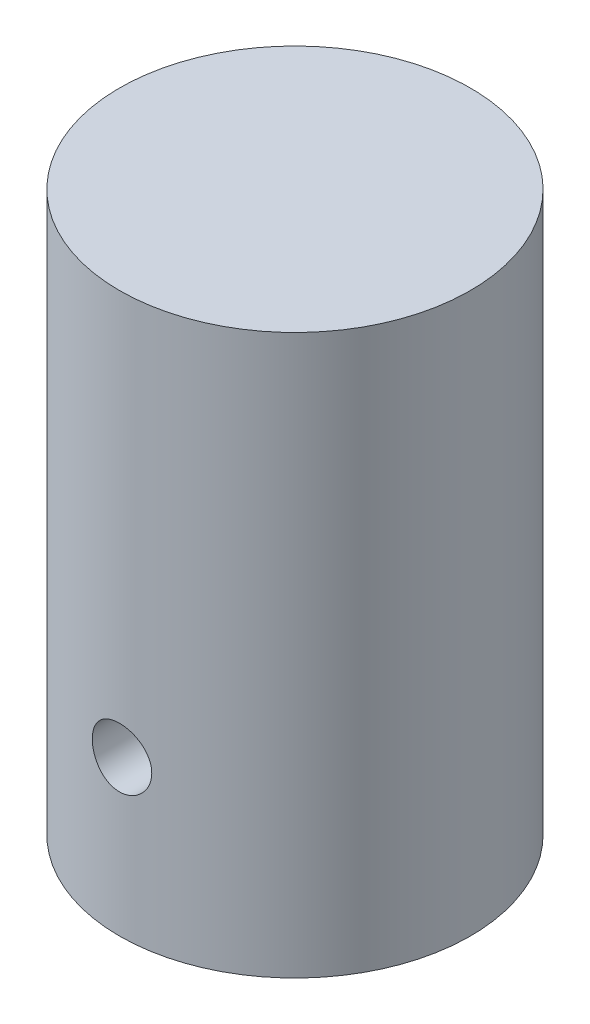
ISO-10303-21;
HEADER;
FILE_DESCRIPTION(('STEP AP214'),'2;1');
FILE_NAME('part.step','',(''),(''),'','','');
FILE_SCHEMA(('AUTOMOTIVE_DESIGN { 1 0 10303 214 1 1 1 1 }'));
ENDSEC;
DATA;
#1=APPLICATION_CONTEXT('core data for automotive mechanical design processes');
#2=APPLICATION_PROTOCOL_DEFINITION('international standard','automotive_design',2000,#1);
#3=PRODUCT_CONTEXT('',#1,'mechanical');
#4=PRODUCT('Part','Part','',(#3));
#5=PRODUCT_RELATED_PRODUCT_CATEGORY('part','',(#4));
#6=PRODUCT_DEFINITION_FORMATION('','',#4);
#7=PRODUCT_DEFINITION_CONTEXT('part definition',#1,'design');
#8=PRODUCT_DEFINITION('design','',#6,#7);
#9=PRODUCT_DEFINITION_SHAPE('','',#8);
#10=(LENGTH_UNIT() NAMED_UNIT(*) SI_UNIT(.MILLI.,.METRE.));
#11=(NAMED_UNIT(*) PLANE_ANGLE_UNIT() SI_UNIT($,.RADIAN.));
#12=(NAMED_UNIT(*) SI_UNIT($,.STERADIAN.) SOLID_ANGLE_UNIT());
#13=UNCERTAINTY_MEASURE_WITH_UNIT(LENGTH_MEASURE(1.E-05),#10,'distance_accuracy_value','');
#14=(GEOMETRIC_REPRESENTATION_CONTEXT(3) GLOBAL_UNCERTAINTY_ASSIGNED_CONTEXT((#13)) GLOBAL_UNIT_ASSIGNED_CONTEXT((#10,
#11,#12)) REPRESENTATION_CONTEXT('',''));
#15=CARTESIAN_POINT('',(0.,0.,0.));
#16=DIRECTION('',(0.,0.,1.));
#17=DIRECTION('',(1.,0.,0.));
#18=AXIS2_PLACEMENT_3D('',#15,#16,#17);
#19=CARTESIAN_POINT('',(0.,119.38,0.));
#20=DIRECTION('',(0.,-1.,0.));
#21=DIRECTION('',(0.,0.,-1.));
#22=AXIS2_PLACEMENT_3D('',#19,#20,#21);
#23=CYLINDRICAL_SURFACE('',#22,37.465);
#24=CARTESIAN_POINT('',(6.35,33.02,36.9229430706708));
#25=CARTESIAN_POINT('',(6.35000279141171,32.8429779279102,36.9229417748591));
#26=CARTESIAN_POINT('',(6.34259532528094,32.6659933481382,36.924218600387));
#27=CARTESIAN_POINT('',(6.3130271330691,32.313242688087,36.9292858540445));
#28=CARTESIAN_POINT('',(6.29086351707607,32.1374768533069,36.9330767745454));
#29=CARTESIAN_POINT('',(6.23193058823662,31.7883737158959,36.9430663826917));
#30=CARTESIAN_POINT('',(6.19515215922365,31.6150379990775,36.9492665730948));
#31=CARTESIAN_POINT('',(6.10725675226593,31.2720688886345,36.9638962260846));
#32=CARTESIAN_POINT('',(6.05613450827856,31.1024368794501,36.9723265073391));
#33=CARTESIAN_POINT('',(5.94001398475862,30.7683400061689,36.9911598987731));
#34=CARTESIAN_POINT('',(5.87503283304677,30.6038690489028,37.0015605720459));
#35=CARTESIAN_POINT('',(5.73160931419481,30.2809531587946,37.024048226987));
#36=CARTESIAN_POINT('',(5.65316198508221,30.1225104736148,37.0361358299416));
#37=CARTESIAN_POINT('',(5.48342916226199,29.8128734349299,37.0616457673502));
#38=CARTESIAN_POINT('',(5.39214998328585,29.6616755649309,37.0750674443417));
#39=CARTESIAN_POINT('',(5.19733044249672,29.367411205207,37.1028794422679));
#40=CARTESIAN_POINT('',(5.09378551997719,29.2243477695128,37.1172701226382));
#41=CARTESIAN_POINT('',(4.87421779068985,28.9461597195228,37.146744116124));
#42=CARTESIAN_POINT('',(4.75809364747908,28.8111156041066,37.1618323914032));
#43=CARTESIAN_POINT('',(4.51488121897134,28.551215519359,37.1921643883722));
#44=CARTESIAN_POINT('',(4.3877888897322,28.4263633410675,37.2074081655528));
#45=CARTESIAN_POINT('',(4.12358831809976,28.1877967478572,37.2376142207968));
#46=CARTESIAN_POINT('',(3.98648315756614,28.0740789308957,37.2525765837088));
#47=CARTESIAN_POINT('',(3.70310692352254,27.858487943453,37.281812153211));
#48=CARTESIAN_POINT('',(3.55683248965142,27.7566191549295,37.2960851037118));
#49=CARTESIAN_POINT('',(3.25528646093831,27.564937093672,37.3236169600895));
#50=CARTESIAN_POINT('',(3.09996739305173,27.4751975512082,37.3368694703722));
#51=CARTESIAN_POINT('',(2.78214446136281,27.309103441585,37.3618966515687));
#52=CARTESIAN_POINT('',(2.61963794116679,27.2327538758421,37.3736707698099));
#53=CARTESIAN_POINT('',(2.28869512625808,27.0940797494783,37.3953948025334));
#54=CARTESIAN_POINT('',(2.12026136913199,27.0317492694472,37.4053454866114));
#55=CARTESIAN_POINT('',(1.77860742000098,26.9215298267097,37.4231499027759));
#56=CARTESIAN_POINT('',(1.60538550554222,26.8736461367658,37.4310028691218));
#57=CARTESIAN_POINT('',(1.08386846683103,26.7531119562433,37.4509148486679));
#58=CARTESIAN_POINT('',(0.73015872504387,26.7020912500178,37.4595677631988));
#59=CARTESIAN_POINT('',(0.0192946776186457,26.6600414383014,37.4666841086695));
#60=CARTESIAN_POINT('',(-0.337859384488472,26.669008122004,37.4651482548085));
#61=CARTESIAN_POINT('',(-1.04184938818574,26.7461584808905,37.4521482632217));
#62=CARTESIAN_POINT('',(-1.38875354291931,26.8137347170075,37.4407859717608));
#63=CARTESIAN_POINT('',(-2.06621277185893,27.0052502774216,37.4095186888445));
#64=CARTESIAN_POINT('',(-2.39676733453492,27.1291913639717,37.3896134302934));
#65=CARTESIAN_POINT('',(-3.03396211682997,27.4305133275901,37.3433249625064));
#66=CARTESIAN_POINT('',(-3.34048213700312,27.6081436009934,37.316911630219));
#67=CARTESIAN_POINT('',(-3.91959227462119,28.0116203392101,37.2605395168837));
#68=CARTESIAN_POINT('',(-4.19217955142351,28.2374708364357,37.2305804394166));
#69=CARTESIAN_POINT('',(-4.69927895714922,28.7343438510591,37.1700034224869));
#70=CARTESIAN_POINT('',(-4.93327053922575,29.0058975034978,37.1393819324612));
#71=CARTESIAN_POINT('',(-5.35245392593285,29.5846815641848,37.0812942455192));
#72=CARTESIAN_POINT('',(-5.53764525006624,29.8919123236743,37.0538280796725));
#73=CARTESIAN_POINT('',(-5.85407953710823,30.5339442406,37.0051585911984));
#74=CARTESIAN_POINT('',(-5.98525815710648,30.8687777135642,36.9839627465329));
#75=CARTESIAN_POINT('',(-6.18936206426045,31.556167311694,36.9503562312994));
#76=CARTESIAN_POINT('',(-6.26229266738911,31.9087218164371,36.9379447590422));
#77=CARTESIAN_POINT('',(-6.34709384460755,32.6168835055322,36.9234678421246));
#78=CARTESIAN_POINT('',(-6.35970721768158,32.9723992502977,36.9212765456527));
#79=CARTESIAN_POINT('',(-6.32549683373919,33.6804613982253,36.9271526737609));
#80=CARTESIAN_POINT('',(-6.27867545446003,34.0330079196058,36.9352196879487));
#81=CARTESIAN_POINT('',(-6.12755856328144,34.7227539742049,36.9605870866626));
#82=CARTESIAN_POINT('',(-6.02364259931067,35.0600391050828,36.9778264723004));
#83=CARTESIAN_POINT('',(-5.76168490296192,35.7124080067798,37.0195448040393));
#84=CARTESIAN_POINT('',(-5.60363983348741,36.0274904073409,37.0440241964792));
#85=CARTESIAN_POINT('',(-5.23616310891025,36.629811414514,37.0977560143979));
#86=CARTESIAN_POINT('',(-5.02625632334476,36.9167562145644,37.1270516831742));
#87=CARTESIAN_POINT('',(-4.56166401992295,37.4516159849238,37.1869892749972));
#88=CARTESIAN_POINT('',(-4.30697524051591,37.6995281099207,37.217631295979));
#89=CARTESIAN_POINT('',(-3.75675903815107,38.1520061184341,37.2772080912782));
#90=CARTESIAN_POINT('',(-3.46082109485542,38.3560760897849,37.3061209088732));
#91=CARTESIAN_POINT('',(-2.83841657324286,38.7115984068522,37.3586264947807));
#92=CARTESIAN_POINT('',(-2.51195100873064,38.8630524991246,37.3822194396744));
#93=CARTESIAN_POINT('',(-1.83928606066536,39.1082817900893,37.421334207005));
#94=CARTESIAN_POINT('',(-1.49318246426715,39.2023144056904,37.4368920013525));
#95=CARTESIAN_POINT('',(-0.789612381808293,39.33083762764,37.4583264559331));
#96=CARTESIAN_POINT('',(-0.432146866718397,39.365333308058,37.4642039411742));
#97=CARTESIAN_POINT('',(0.101984465339863,39.3716501433896,37.4652822069458));
#98=CARTESIAN_POINT('',(0.278660824538069,39.3663448034955,37.4643792461815));
#99=CARTESIAN_POINT('',(0.630910248375704,39.3410416873006,37.4600999348255));
#100=CARTESIAN_POINT('',(0.806483702727592,39.3210494338571,37.4567245139773));
#101=CARTESIAN_POINT('',(1.15534231245423,39.2665096396473,37.4475887044141));
#102=CARTESIAN_POINT('',(1.32862663390469,39.2319569375789,37.4418274700023));
#103=CARTESIAN_POINT('',(1.67157269701812,39.1485780582277,37.4280844037534));
#104=CARTESIAN_POINT('',(1.84123571960936,39.0997570208375,37.4201033716055));
#105=CARTESIAN_POINT('',(2.17567198668656,38.9882491419048,37.4021483486495));
#106=CARTESIAN_POINT('',(2.34044923358439,38.925574026656,37.3921760439695));
#107=CARTESIAN_POINT('',(2.66407136469494,38.7868196261229,37.3705130033313));
#108=CARTESIAN_POINT('',(2.82291834908299,38.7107451418,37.3588228831101));
#109=CARTESIAN_POINT('',(3.13372361602806,38.5456899649814,37.3340369935162));
#110=CARTESIAN_POINT('',(3.28567916728831,38.4567042130054,37.3209406736277));
#111=CARTESIAN_POINT('',(3.58156051285462,38.266507812355,37.2937088207987));
#112=CARTESIAN_POINT('',(3.72548910131004,38.1653014569379,37.2795736534978));
#113=CARTESIAN_POINT('',(4.0061175405423,37.9500279829882,37.2504683547157));
#114=CARTESIAN_POINT('',(4.14270774436707,37.8358189937871,37.2354901389976));
#115=CARTESIAN_POINT('',(4.40575720486539,37.5963983703591,37.2052826069384));
#116=CARTESIAN_POINT('',(4.53222005739372,37.4711906747823,37.1900533820582));
#117=CARTESIAN_POINT('',(4.77427711512343,37.2105169336016,37.1597550265217));
#118=CARTESIAN_POINT('',(4.8898647624007,37.0750447861258,37.1446859972621));
#119=CARTESIAN_POINT('',(5.10924511026962,36.7948850831837,37.1151463601762));
#120=CARTESIAN_POINT('',(5.2130421433657,36.6502009433935,37.1006755337894));
#121=CARTESIAN_POINT('',(5.40891750548062,36.3514062770834,37.0726274388618));
#122=CARTESIAN_POINT('',(5.50089893076861,36.1972314673241,37.0590579519227));
#123=CARTESIAN_POINT('',(5.67149208696552,35.8816160179082,37.0333342280351));
#124=CARTESIAN_POINT('',(5.75010873763827,35.720178079709,37.0211794708262));
#125=CARTESIAN_POINT('',(5.89338024297566,35.3912284690087,36.9986426334629));
#126=CARTESIAN_POINT('',(5.95804473056657,35.2237210809342,36.9882593312945));
#127=CARTESIAN_POINT('',(6.0729737087923,34.8837837201648,36.9695630766091));
#128=CARTESIAN_POINT('',(6.1232412714356,34.7113548062705,36.9612496824657));
#129=CARTESIAN_POINT('',(6.22707453855869,34.2892845729493,36.9439259134538));
#130=CARTESIAN_POINT('',(6.27311607180392,34.037703905521,36.9360961033579));
#131=CARTESIAN_POINT('',(6.3345764955392,33.530722778203,36.9256056660701));
#132=CARTESIAN_POINT('',(6.34999597389238,33.2753223917367,36.9229449396454));
#133=CARTESIAN_POINT('',(6.35,33.02,36.9229430706708));
#134=B_SPLINE_CURVE_WITH_KNOTS('',3,(#24,#25,#26,#27,#28,#29,#30,#31,#32,#33,#34,#35,#36,#37,
#38,#39,#40,#41,#42,#43,#44,#45,#46,#47,#48,#49,#50,#51,#52,#53,#54,#55,#56,#57,#58,#59,#60,#61,
#62,#63,#64,#65,#66,#67,#68,#69,#70,#71,#72,#73,#74,#75,#76,#77,#78,#79,#80,#81,#82,#83,#84,#85,
#86,#87,#88,#89,#90,#91,#92,#93,#94,#95,#96,#97,#98,#99,#100,#101,#102,#103,#104,#105,#106,#107,
#108,#109,#110,#111,#112,#113,#114,#115,#116,#117,#118,#119,#120,#121,#122,#123,#124,#125,#126,
#127,#128,#129,#130,#131,#132,#133),.UNSPECIFIED.,.T.,.F.,(4,2,2,2,2,2,2,2,2,2,2,2,2,2,2,2,2,2,
2,2,2,2,2,2,2,2,2,2,2,2,2,2,2,2,2,2,2,2,2,2,2,2,2,2,2,2,2,2,2,2,2,2,2,2,4),(0.,
0.530842262782578,1.06178851873756,1.59306648002144,2.12453974509419,2.65535994507213,
3.18637616143376,3.71713196622598,4.24808574227657,4.783689476758,5.31949153759851,
5.85512937282707,6.39096466978,6.92992324743332,7.46908270980697,8.00801408863622,
8.54714192834565,9.61394141379653,10.6806660161912,11.7364652602675,12.7922975162911,
13.853111719601,14.9140146681803,15.9882265295015,17.0624489673338,18.1379474014621,
19.2133476696029,20.2754698080297,21.337549456706,22.3926526711854,23.4478209452153,
24.5130399581971,25.5783365850975,26.6551133948241,27.7318544581056,28.8037324268096,
29.8755190395879,30.4052775528997,30.9348369580735,31.4645842364605,31.9941409183267,
32.5232510804091,33.0521720478237,33.5813008437124,34.1102442876548,34.6456425169921,
35.1808497951281,35.7163777706953,36.2517083235993,36.7911816411863,37.3304559389127,
37.8693567080755,38.408142401051,39.1738012625574,39.9394454252798),.UNSPECIFIED.);
#135=CARTESIAN_POINT('',(6.35,33.02,36.9229430706708));
#136=VERTEX_POINT('',#135);
#137=EDGE_CURVE('E12',#136,#136,#134,.T.);
#138=ORIENTED_EDGE('',*,*,#137,.T.);
#139=EDGE_LOOP('',(#138));
#140=FACE_BOUND('',#139,.T.);
#141=CARTESIAN_POINT('',(0.,119.38,0.));
#142=DIRECTION('',(0.,1.,0.));
#143=DIRECTION('',(0.,0.,1.));
#144=AXIS2_PLACEMENT_3D('',#141,#142,#143);
#145=CIRCLE('',#144,37.465);
#146=CARTESIAN_POINT('',(0.,119.38,37.465));
#147=VERTEX_POINT('',#146);
#148=EDGE_CURVE('E54',#147,#147,#145,.T.);
#149=ORIENTED_EDGE('',*,*,#148,.F.);
#150=EDGE_LOOP('',(#149));
#151=FACE_BOUND('',#150,.T.);
#152=CARTESIAN_POINT('',(0.,0.,0.));
#153=DIRECTION('',(0.,1.,0.));
#154=DIRECTION('',(0.,0.,1.));
#155=AXIS2_PLACEMENT_3D('',#152,#153,#154);
#156=CIRCLE('',#155,37.465);
#157=CARTESIAN_POINT('',(0.,0.,37.465));
#158=VERTEX_POINT('',#157);
#159=EDGE_CURVE('E58',#158,#158,#156,.T.);
#160=ORIENTED_EDGE('',*,*,#159,.T.);
#161=EDGE_LOOP('',(#160));
#162=FACE_BOUND('',#161,.T.);
#163=ADVANCED_FACE('F43',(#140,#151,#162),#23,.T.);
#164=CARTESIAN_POINT('',(0.,119.38,0.));
#165=DIRECTION('',(0.,1.,0.));
#166=DIRECTION('',(0.,0.,1.));
#167=AXIS2_PLACEMENT_3D('',#164,#165,#166);
#168=PLANE('',#167);
#169=ORIENTED_EDGE('',*,*,#148,.T.);
#170=EDGE_LOOP('',(#169));
#171=FACE_BOUND('',#170,.T.);
#172=ADVANCED_FACE('F87',(#171),#168,.T.);
#173=CARTESIAN_POINT('',(0.,0.,0.));
#174=DIRECTION('',(0.,1.,0.));
#175=DIRECTION('',(0.,0.,1.));
#176=AXIS2_PLACEMENT_3D('',#173,#174,#175);
#177=PLANE('',#176);
#178=CARTESIAN_POINT('',(0.,0.,0.));
#179=DIRECTION('',(0.,-1.,0.));
#180=DIRECTION('',(0.,0.,-1.));
#181=AXIS2_PLACEMENT_3D('',#178,#179,#180);
#182=CIRCLE('',#181,6.35);
#183=CARTESIAN_POINT('',(0.,0.,-6.35));
#184=VERTEX_POINT('',#183);
#185=EDGE_CURVE('E68',#184,#184,#182,.T.);
#186=ORIENTED_EDGE('',*,*,#185,.F.);
#187=EDGE_LOOP('',(#186));
#188=FACE_BOUND('',#187,.T.);
#189=ORIENTED_EDGE('',*,*,#159,.F.);
#190=EDGE_LOOP('',(#189));
#191=FACE_BOUND('',#190,.T.);
#192=ADVANCED_FACE('F83',(#188,#191),#177,.F.);
#193=CARTESIAN_POINT('',(0.,33.02,18.415));
#194=DIRECTION('',(0.,0.,1.));
#195=DIRECTION('',(1.,0.,0.));
#196=AXIS2_PLACEMENT_3D('',#193,#194,#195);
#197=CYLINDRICAL_SURFACE('',#196,6.35);
#198=CARTESIAN_POINT('',(0.,33.02,18.415));
#199=DIRECTION('',(0.,0.,1.));
#200=DIRECTION('',(1.,0.,0.));
#201=AXIS2_PLACEMENT_3D('',#198,#199,#200);
#202=CIRCLE('',#201,6.35);
#203=CARTESIAN_POINT('',(6.35,33.02,18.415));
#204=VERTEX_POINT('',#203);
#205=EDGE_CURVE('E63',#204,#204,#202,.T.);
#206=ORIENTED_EDGE('',*,*,#205,.F.);
#207=EDGE_LOOP('',(#206));
#208=FACE_BOUND('',#207,.T.);
#209=ORIENTED_EDGE('',*,*,#137,.F.);
#210=EDGE_LOOP('',(#209));
#211=FACE_BOUND('',#210,.T.);
#212=ADVANCED_FACE('F86',(#208,#211),#197,.F.);
#213=CARTESIAN_POINT('',(0.,33.02,18.415));
#214=DIRECTION('',(0.,0.,1.));
#215=DIRECTION('',(1.,0.,0.));
#216=AXIS2_PLACEMENT_3D('',#213,#214,#215);
#217=PLANE('',#216);
#218=ORIENTED_EDGE('',*,*,#205,.T.);
#219=EDGE_LOOP('',(#218));
#220=FACE_BOUND('',#219,.T.);
#221=ADVANCED_FACE('F79',(#220),#217,.T.);
#222=CARTESIAN_POINT('',(0.,19.05,0.));
#223=DIRECTION('',(0.,-1.,0.));
#224=DIRECTION('',(0.,0.,-1.));
#225=AXIS2_PLACEMENT_3D('',#222,#223,#224);
#226=CYLINDRICAL_SURFACE('',#225,6.35);
#227=CARTESIAN_POINT('',(0.,19.05,0.));
#228=DIRECTION('',(0.,-1.,0.));
#229=DIRECTION('',(0.,0.,-1.));
#230=AXIS2_PLACEMENT_3D('',#227,#228,#229);
#231=CIRCLE('',#230,6.35);
#232=CARTESIAN_POINT('',(0.,19.05,-6.35));
#233=VERTEX_POINT('',#232);
#234=EDGE_CURVE('E67',#233,#233,#231,.T.);
#235=CARTESIAN_POINT('',(0.,19.05,-6.35));
#236=CARTESIAN_POINT('',(0.,18.8515625,-6.35));
#237=CARTESIAN_POINT('',(0.,18.653125,-6.35));
#238=CARTESIAN_POINT('',(0.,18.25625,-6.35));
#239=CARTESIAN_POINT('',(0.,18.0578125,-6.35));
#240=CARTESIAN_POINT('',(0.,17.6609375,-6.35));
#241=CARTESIAN_POINT('',(0.,17.4625,-6.35));
#242=CARTESIAN_POINT('',(0.,17.065625,-6.35));
#243=CARTESIAN_POINT('',(0.,16.8671875,-6.35));
#244=CARTESIAN_POINT('',(0.,16.4703125,-6.35));
#245=CARTESIAN_POINT('',(0.,16.271875,-6.35));
#246=CARTESIAN_POINT('',(0.,15.875,-6.35));
#247=CARTESIAN_POINT('',(0.,15.6765625,-6.35));
#248=CARTESIAN_POINT('',(0.,15.2796875,-6.35));
#249=CARTESIAN_POINT('',(0.,15.08125,-6.35));
#250=CARTESIAN_POINT('',(0.,14.684375,-6.35));
#251=CARTESIAN_POINT('',(0.,14.4859375,-6.35));
#252=CARTESIAN_POINT('',(0.,14.0890625,-6.35));
#253=CARTESIAN_POINT('',(0.,13.890625,-6.35));
#254=CARTESIAN_POINT('',(0.,13.49375,-6.35));
#255=CARTESIAN_POINT('',(0.,13.2953125,-6.35));
#256=CARTESIAN_POINT('',(0.,12.8984375,-6.35));
#257=CARTESIAN_POINT('',(0.,12.7,-6.35));
#258=CARTESIAN_POINT('',(0.,12.303125,-6.35));
#259=CARTESIAN_POINT('',(0.,12.1046875,-6.35));
#260=CARTESIAN_POINT('',(0.,11.7078125,-6.35));
#261=CARTESIAN_POINT('',(0.,11.509375,-6.35));
#262=CARTESIAN_POINT('',(0.,11.1125,-6.35));
#263=CARTESIAN_POINT('',(0.,10.9140625,-6.35));
#264=CARTESIAN_POINT('',(0.,10.5171875,-6.35));
#265=CARTESIAN_POINT('',(0.,10.31875,-6.35));
#266=CARTESIAN_POINT('',(0.,9.921875,-6.35));
#267=CARTESIAN_POINT('',(0.,9.7234375,-6.35));
#268=CARTESIAN_POINT('',(0.,9.3265625,-6.35));
#269=CARTESIAN_POINT('',(0.,9.128125,-6.35));
#270=CARTESIAN_POINT('',(0.,8.73125,-6.35));
#271=CARTESIAN_POINT('',(0.,8.5328125,-6.35));
#272=CARTESIAN_POINT('',(0.,8.1359375,-6.35));
#273=CARTESIAN_POINT('',(0.,7.9375,-6.35));
#274=CARTESIAN_POINT('',(0.,7.540625,-6.35));
#275=CARTESIAN_POINT('',(0.,7.3421875,-6.35));
#276=CARTESIAN_POINT('',(0.,6.9453125,-6.35));
#277=CARTESIAN_POINT('',(0.,6.746875,-6.35));
#278=CARTESIAN_POINT('',(0.,6.35,-6.35));
#279=CARTESIAN_POINT('',(0.,6.1515625,-6.35));
#280=CARTESIAN_POINT('',(0.,5.7546875,-6.35));
#281=CARTESIAN_POINT('',(0.,5.55625,-6.35));
#282=CARTESIAN_POINT('',(0.,5.159375,-6.35));
#283=CARTESIAN_POINT('',(0.,4.9609375,-6.35));
#284=CARTESIAN_POINT('',(0.,4.5640625,-6.35));
#285=CARTESIAN_POINT('',(0.,4.365625,-6.35));
#286=CARTESIAN_POINT('',(0.,3.96875,-6.35));
#287=CARTESIAN_POINT('',(0.,3.7703125,-6.35));
#288=CARTESIAN_POINT('',(0.,3.3734375,-6.35));
#289=CARTESIAN_POINT('',(0.,3.175,-6.35));
#290=CARTESIAN_POINT('',(0.,2.778125,-6.35));
#291=CARTESIAN_POINT('',(0.,2.5796875,-6.35));
#292=CARTESIAN_POINT('',(0.,2.1828125,-6.35));
#293=CARTESIAN_POINT('',(0.,1.984375,-6.35));
#294=CARTESIAN_POINT('',(0.,1.5875,-6.35));
#295=CARTESIAN_POINT('',(0.,1.3890625,-6.35));
#296=CARTESIAN_POINT('',(0.,0.992187500000001,-6.35));
#297=CARTESIAN_POINT('',(0.,0.793750000000001,-6.35));
#298=CARTESIAN_POINT('',(0.,0.396875,-6.35));
#299=CARTESIAN_POINT('',(0.,0.1984375,-6.35));
#300=CARTESIAN_POINT('',(0.,0.,-6.35));
#301=B_SPLINE_CURVE_WITH_KNOTS('',3,(#235,#236,#237,#238,#239,#240,#241,#242,#243,#244,#245,
#246,#247,#248,#249,#250,#251,#252,#253,#254,#255,#256,#257,#258,#259,#260,#261,#262,#263,#264,
#265,#266,#267,#268,#269,#270,#271,#272,#273,#274,#275,#276,#277,#278,#279,#280,#281,#282,#283,
#284,#285,#286,#287,#288,#289,#290,#291,#292,#293,#294,#295,#296,#297,#298,#299,#300),
.UNSPECIFIED.,.F.,.F.,(4,2,2,2,2,2,2,2,2,2,2,2,2,2,2,2,2,2,2,2,2,2,2,2,2,2,2,2,2,2,2,2,4),(0.,
0.595312499999997,1.190625,1.7859375,2.38125,2.9765625,3.571875,4.1671875,4.7625,5.3578125,
5.953125,6.5484375,7.14375,7.7390625,8.334375,8.9296875,9.525,10.1203125,10.715625,11.3109375,
11.90625,12.5015625,13.096875,13.6921875,14.2875,14.8828125,15.478125,16.0734375,16.66875,
17.2640625,17.859375,18.4546875,19.05),.UNSPECIFIED.);
#302=EDGE_CURVE('BSEAM76',#233,#184,#301,.T.);
#303=ORIENTED_EDGE('',*,*,#234,.F.);
#304=ORIENTED_EDGE('',*,*,#185,.T.);
#305=ORIENTED_EDGE('',*,*,#302,.T.);
#306=ORIENTED_EDGE('',*,*,#302,.F.);
#307=EDGE_LOOP('',(#303,#305,#304,#306));
#308=FACE_BOUND('',#307,.T.);
#309=ADVANCED_FACE('F76',(#308),#226,.F.);
#310=CARTESIAN_POINT('',(0.,19.05,0.));
#311=DIRECTION('',(0.,-1.,0.));
#312=DIRECTION('',(0.,0.,-1.));
#313=AXIS2_PLACEMENT_3D('',#310,#311,#312);
#314=PLANE('',#313);
#315=ORIENTED_EDGE('',*,*,#234,.T.);
#316=EDGE_LOOP('',(#315));
#317=FACE_BOUND('',#316,.T.);
#318=ADVANCED_FACE('F74',(#317),#314,.T.);
#319=CLOSED_SHELL('',(#163,#172,#192,#212,#221,#309,#318));
#320=MANIFOLD_SOLID_BREP('B2',#319);
#321=ADVANCED_BREP_SHAPE_REPRESENTATION('',(#18,#320),#14);
#322=SHAPE_DEFINITION_REPRESENTATION(#9,#321);
ENDSEC;
END-ISO-10303-21;
